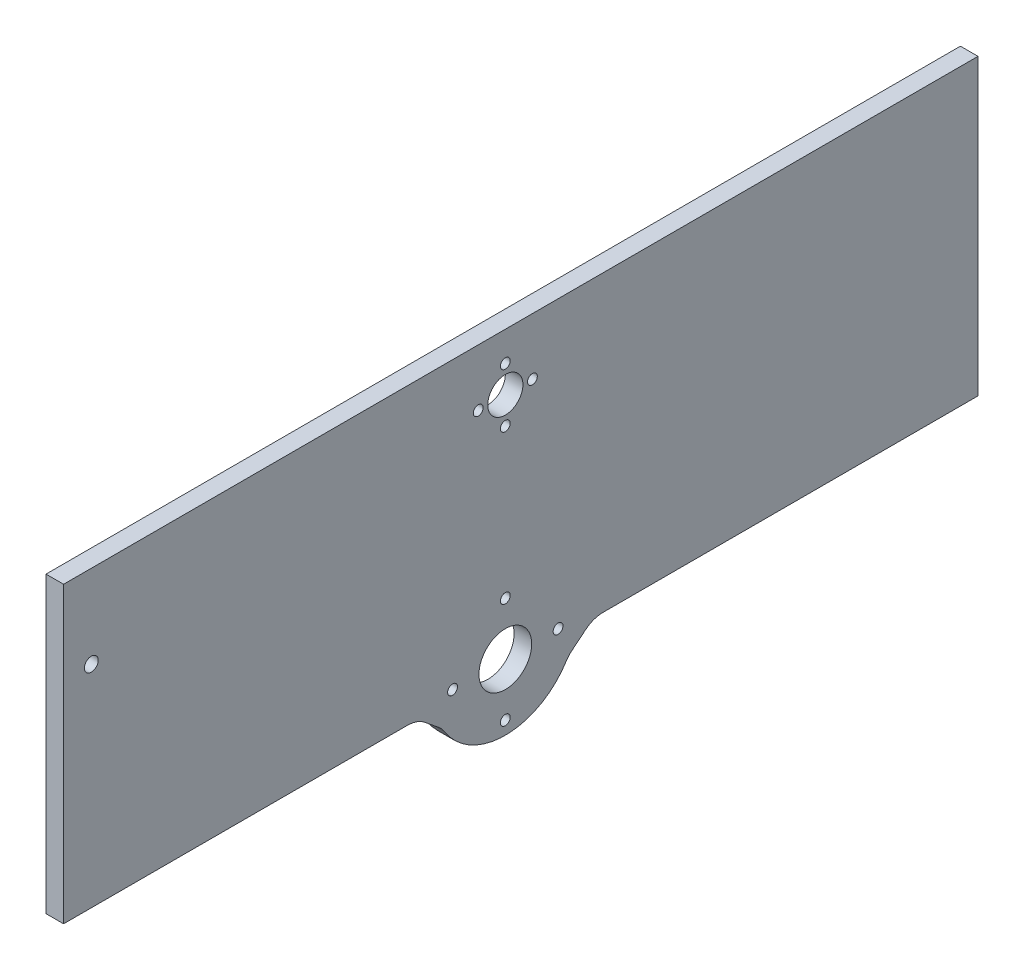
ISO-10303-21;
HEADER;
FILE_DESCRIPTION(('STEP AP214'),'2;1');
FILE_NAME('part.step','',(''),(''),'','','');
FILE_SCHEMA(('AUTOMOTIVE_DESIGN { 1 0 10303 214 1 1 1 1 }'));
ENDSEC;
DATA;
#1=APPLICATION_CONTEXT('core data for automotive mechanical design processes');
#2=APPLICATION_PROTOCOL_DEFINITION('international standard','automotive_design',2000,#1);
#3=PRODUCT_CONTEXT('',#1,'mechanical');
#4=PRODUCT('Part','Part','',(#3));
#5=PRODUCT_RELATED_PRODUCT_CATEGORY('part','',(#4));
#6=PRODUCT_DEFINITION_FORMATION('','',#4);
#7=PRODUCT_DEFINITION_CONTEXT('part definition',#1,'design');
#8=PRODUCT_DEFINITION('design','',#6,#7);
#9=PRODUCT_DEFINITION_SHAPE('','',#8);
#10=(LENGTH_UNIT() NAMED_UNIT(*) SI_UNIT(.MILLI.,.METRE.));
#11=(NAMED_UNIT(*) PLANE_ANGLE_UNIT() SI_UNIT($,.RADIAN.));
#12=(NAMED_UNIT(*) SI_UNIT($,.STERADIAN.) SOLID_ANGLE_UNIT());
#13=UNCERTAINTY_MEASURE_WITH_UNIT(LENGTH_MEASURE(1.E-05),#10,'distance_accuracy_value','');
#14=(GEOMETRIC_REPRESENTATION_CONTEXT(3) GLOBAL_UNCERTAINTY_ASSIGNED_CONTEXT((#13)) GLOBAL_UNIT_ASSIGNED_CONTEXT((#10,
#11,#12)) REPRESENTATION_CONTEXT('',''));
#15=CARTESIAN_POINT('',(0.,0.,0.));
#16=DIRECTION('',(0.,0.,1.));
#17=DIRECTION('',(1.,0.,0.));
#18=AXIS2_PLACEMENT_3D('',#15,#16,#17);
#19=CARTESIAN_POINT('',(6.35,0.,0.));
#20=DIRECTION('',(-1.,0.,0.));
#21=DIRECTION('',(0.,0.,1.));
#22=AXIS2_PLACEMENT_3D('',#19,#20,#21);
#23=PLANE('',#22);
#24=CARTESIAN_POINT('',(6.35,97.0026,-10.));
#25=DIRECTION('',(1.,0.,0.));
#26=DIRECTION('',(0.,0.,-1.));
#27=AXIS2_PLACEMENT_3D('',#24,#25,#26);
#28=CIRCLE('',#27,2.5);
#29=CARTESIAN_POINT('',(6.35,97.0026,-12.5));
#30=VERTEX_POINT('',#29);
#31=EDGE_CURVE('E415',#30,#30,#28,.T.);
#32=ORIENTED_EDGE('',*,*,#31,.F.);
#33=EDGE_LOOP('',(#32));
#34=FACE_BOUND('',#33,.T.);
#35=CARTESIAN_POINT('',(6.35,116.2812,-159.512));
#36=DIRECTION('',(1.,0.,0.));
#37=DIRECTION('',(0.,0.,-1.));
#38=AXIS2_PLACEMENT_3D('',#35,#36,#37);
#39=CIRCLE('',#38,1.778);
#40=CARTESIAN_POINT('',(6.35,116.2812,-161.29));
#41=VERTEX_POINT('',#40);
#42=EDGE_CURVE('E443',#41,#41,#39,.T.);
#43=ORIENTED_EDGE('',*,*,#42,.F.);
#44=EDGE_LOOP('',(#43));
#45=FACE_BOUND('',#44,.T.);
#46=CARTESIAN_POINT('',(6.35,106.5022,-149.733));
#47=DIRECTION('',(1.,0.,0.));
#48=DIRECTION('',(0.,0.,-1.));
#49=AXIS2_PLACEMENT_3D('',#46,#47,#48);
#50=CIRCLE('',#49,1.778);
#51=CARTESIAN_POINT('',(6.35,106.5022,-151.511));
#52=VERTEX_POINT('',#51);
#53=EDGE_CURVE('E426',#52,#52,#50,.T.);
#54=ORIENTED_EDGE('',*,*,#53,.F.);
#55=EDGE_LOOP('',(#54));
#56=FACE_BOUND('',#55,.T.);
#57=CARTESIAN_POINT('',(6.35,106.5022,-169.291));
#58=DIRECTION('',(1.,0.,0.));
#59=DIRECTION('',(0.,0.,-1.));
#60=AXIS2_PLACEMENT_3D('',#57,#58,#59);
#61=CIRCLE('',#60,1.778);
#62=CARTESIAN_POINT('',(6.35,106.5022,-171.069));
#63=VERTEX_POINT('',#62);
#64=EDGE_CURVE('E427',#63,#63,#61,.T.);
#65=ORIENTED_EDGE('',*,*,#64,.F.);
#66=EDGE_LOOP('',(#65));
#67=FACE_BOUND('',#66,.T.);
#68=CARTESIAN_POINT('',(6.35,96.7232,-159.512));
#69=DIRECTION('',(1.,0.,0.));
#70=DIRECTION('',(0.,0.,-1.));
#71=AXIS2_PLACEMENT_3D('',#68,#69,#70);
#72=CIRCLE('',#71,1.778);
#73=CARTESIAN_POINT('',(6.35,96.7232,-161.29));
#74=VERTEX_POINT('',#73);
#75=EDGE_CURVE('E419',#74,#74,#72,.T.);
#76=ORIENTED_EDGE('',*,*,#75,.F.);
#77=EDGE_LOOP('',(#76));
#78=FACE_BOUND('',#77,.T.);
#79=CARTESIAN_POINT('',(6.35,106.5022,-159.512));
#80=DIRECTION('',(1.,0.,0.));
#81=DIRECTION('',(0.,0.,-1.));
#82=AXIS2_PLACEMENT_3D('',#79,#80,#81);
#83=CIRCLE('',#82,6.34999999999999);
#84=CARTESIAN_POINT('',(6.35,106.5022,-165.862));
#85=VERTEX_POINT('',#84);
#86=EDGE_CURVE('E442',#85,#85,#83,.T.);
#87=ORIENTED_EDGE('',*,*,#86,.F.);
#88=EDGE_LOOP('',(#87));
#89=FACE_BOUND('',#88,.T.);
#90=CARTESIAN_POINT('',(6.35,23.8252,-140.462));
#91=DIRECTION('',(1.,0.,0.));
#92=DIRECTION('',(0.,0.,-1.));
#93=AXIS2_PLACEMENT_3D('',#90,#91,#92);
#94=CIRCLE('',#93,1.77800000000001);
#95=CARTESIAN_POINT('',(6.35,23.8252,-142.24));
#96=VERTEX_POINT('',#95);
#97=EDGE_CURVE('E458',#96,#96,#94,.T.);
#98=ORIENTED_EDGE('',*,*,#97,.F.);
#99=EDGE_LOOP('',(#98));
#100=FACE_BOUND('',#99,.T.);
#101=CARTESIAN_POINT('',(6.35,42.8752,-159.512));
#102=DIRECTION('',(1.,0.,0.));
#103=DIRECTION('',(0.,0.,-1.));
#104=AXIS2_PLACEMENT_3D('',#101,#102,#103);
#105=CIRCLE('',#104,1.77800000000001);
#106=CARTESIAN_POINT('',(6.35,42.8752,-161.29));
#107=VERTEX_POINT('',#106);
#108=EDGE_CURVE('E467',#107,#107,#105,.T.);
#109=ORIENTED_EDGE('',*,*,#108,.F.);
#110=EDGE_LOOP('',(#109));
#111=FACE_BOUND('',#110,.T.);
#112=CARTESIAN_POINT('',(6.35,23.8252,-159.512));
#113=DIRECTION('',(1.,0.,0.));
#114=DIRECTION('',(0.,0.,-1.));
#115=AXIS2_PLACEMENT_3D('',#112,#113,#114);
#116=CIRCLE('',#115,9.52500000000002);
#117=CARTESIAN_POINT('',(6.35,23.8252,-169.037));
#118=VERTEX_POINT('',#117);
#119=EDGE_CURVE('E482',#118,#118,#116,.T.);
#120=ORIENTED_EDGE('',*,*,#119,.F.);
#121=EDGE_LOOP('',(#120));
#122=FACE_BOUND('',#121,.T.);
#123=CARTESIAN_POINT('',(6.35,23.8252,-178.562));
#124=DIRECTION('',(1.,0.,0.));
#125=DIRECTION('',(0.,0.,-1.));
#126=AXIS2_PLACEMENT_3D('',#123,#124,#125);
#127=CIRCLE('',#126,1.77800000000001);
#128=CARTESIAN_POINT('',(6.35,23.8252,-180.34));
#129=VERTEX_POINT('',#128);
#130=EDGE_CURVE('E466',#129,#129,#127,.T.);
#131=ORIENTED_EDGE('',*,*,#130,.F.);
#132=EDGE_LOOP('',(#131));
#133=FACE_BOUND('',#132,.T.);
#134=CARTESIAN_POINT('',(6.35,4.77520000000007,-159.512));
#135=DIRECTION('',(1.,0.,0.));
#136=DIRECTION('',(0.,0.,-1.));
#137=AXIS2_PLACEMENT_3D('',#134,#135,#136);
#138=CIRCLE('',#137,1.77800000000001);
#139=CARTESIAN_POINT('',(6.35,4.77520000000007,-161.29));
#140=VERTEX_POINT('',#139);
#141=EDGE_CURVE('E483',#140,#140,#138,.T.);
#142=ORIENTED_EDGE('',*,*,#141,.F.);
#143=EDGE_LOOP('',(#142));
#144=FACE_BOUND('',#143,.T.);
#145=DIRECTION('',(0.,0.,-1.));
#146=VECTOR('',#145,1.);
#147=CARTESIAN_POINT('',(6.35,20.8026000000001,0.));
#148=LINE('',#147,#146);
#149=CARTESIAN_POINT('',(6.35,20.8026000000001,0.));
#150=VERTEX_POINT('',#149);
#151=CARTESIAN_POINT('',(6.35,20.8026,-124.189615658331));
#152=VERTEX_POINT('',#151);
#153=EDGE_CURVE('E300',#150,#152,#148,.T.);
#154=ORIENTED_EDGE('',*,*,#153,.T.);
#155=CARTESIAN_POINT('',(6.35,10.8026,-124.189615658331));
#156=DIRECTION('',(-1.,0.,0.));
#157=DIRECTION('',(0.,0.,1.));
#158=AXIS2_PLACEMENT_3D('',#155,#156,#157);
#159=CIRCLE('',#158,10.);
#160=CARTESIAN_POINT('',(6.35,18.5390682624872,-130.525786333394));
#161=VERTEX_POINT('',#160);
#162=EDGE_CURVE('E110',#152,#161,#159,.T.);
#163=ORIENTED_EDGE('',*,*,#162,.T.);
#164=DIRECTION('',(0.,-0.633617067506308,-0.773646826248713));
#165=VECTOR('',#164,1.);
#166=CARTESIAN_POINT('',(6.35,75.0793742249907,-61.4900382352941));
#167=LINE('',#166,#165);
#168=CARTESIAN_POINT('',(6.35,14.479941473782,-135.481982620501));
#169=VERTEX_POINT('',#168);
#170=EDGE_CURVE('E245',#161,#169,#167,.T.);
#171=ORIENTED_EDGE('',*,*,#170,.T.);
#172=CARTESIAN_POINT('',(6.35,6.74347321129488,-129.145811945438));
#173=DIRECTION('',(-1.,0.,0.));
#174=DIRECTION('',(0.,0.,1.));
#175=AXIS2_PLACEMENT_3D('',#172,#173,#174);
#176=CIRCLE('',#175,10.);
#177=CARTESIAN_POINT('',(6.35,12.0805921788523,-137.602475656745));
#178=VERTEX_POINT('',#177);
#179=EDGE_CURVE('E292',#169,#178,#176,.T.);
#180=ORIENTED_EDGE('',*,*,#179,.T.);
#181=CARTESIAN_POINT('',(6.35,25.908,-159.512));
#182=DIRECTION('',(1.,0.,0.));
#183=DIRECTION('',(0.,0.,-1.));
#184=AXIS2_PLACEMENT_3D('',#181,#182,#183);
#185=CIRCLE('',#184,25.908);
#186=CARTESIAN_POINT('',(6.35,12.0805921788522,-181.421524343254));
#187=VERTEX_POINT('',#186);
#188=EDGE_CURVE('E211',#178,#187,#185,.T.);
#189=ORIENTED_EDGE('',*,*,#188,.T.);
#190=CARTESIAN_POINT('',(6.35,6.7434732112947,-189.878188054562));
#191=DIRECTION('',(-1.,0.,0.));
#192=DIRECTION('',(0.,0.,1.));
#193=AXIS2_PLACEMENT_3D('',#190,#191,#192);
#194=CIRCLE('',#193,10.);
#195=CARTESIAN_POINT('',(6.35,14.4799414737819,-183.542017379498));
#196=VERTEX_POINT('',#195);
#197=EDGE_CURVE('E283',#187,#196,#194,.T.);
#198=ORIENTED_EDGE('',*,*,#197,.T.);
#199=DIRECTION('',(0.,0.633617067506306,-0.773646826248715));
#200=VECTOR('',#199,1.);
#201=CARTESIAN_POINT('',(6.35,-81.304861308323,-66.5887147058818));
#202=LINE('',#201,#200);
#203=CARTESIAN_POINT('',(6.35,18.5390682624872,-188.498213666606));
#204=VERTEX_POINT('',#203);
#205=EDGE_CURVE('E237',#196,#204,#202,.T.);
#206=ORIENTED_EDGE('',*,*,#205,.T.);
#207=CARTESIAN_POINT('',(6.35,10.8026,-194.83438434167));
#208=DIRECTION('',(-1.,0.,0.));
#209=DIRECTION('',(0.,0.,1.));
#210=AXIS2_PLACEMENT_3D('',#207,#208,#209);
#211=CIRCLE('',#210,10.);
#212=CARTESIAN_POINT('',(6.35,20.8026,-194.83438434167));
#213=VERTEX_POINT('',#212);
#214=EDGE_CURVE('E280',#204,#213,#211,.T.);
#215=ORIENTED_EDGE('',*,*,#214,.T.);
#216=DIRECTION('',(0.,0.,-1.));
#217=VECTOR('',#216,1.);
#218=CARTESIAN_POINT('',(6.35,20.8026,0.));
#219=LINE('',#218,#217);
#220=CARTESIAN_POINT('',(6.35,20.8026,-330.2));
#221=VERTEX_POINT('',#220);
#222=EDGE_CURVE('E202',#213,#221,#219,.T.);
#223=ORIENTED_EDGE('',*,*,#222,.T.);
#224=DIRECTION('',(0.,1.,0.));
#225=VECTOR('',#224,1.);
#226=CARTESIAN_POINT('',(6.35,0.,-330.2));
#227=LINE('',#226,#225);
#228=CARTESIAN_POINT('',(6.35,127.,-330.2));
#229=VERTEX_POINT('',#228);
#230=EDGE_CURVE('E209',#221,#229,#227,.T.);
#231=ORIENTED_EDGE('',*,*,#230,.T.);
#232=DIRECTION('',(0.,0.,1.));
#233=VECTOR('',#232,1.);
#234=CARTESIAN_POINT('',(6.35,127.,0.));
#235=LINE('',#234,#233);
#236=CARTESIAN_POINT('',(6.35,127.,0.));
#237=VERTEX_POINT('',#236);
#238=EDGE_CURVE('E234',#229,#237,#235,.T.);
#239=ORIENTED_EDGE('',*,*,#238,.T.);
#240=DIRECTION('',(0.,-1.,0.));
#241=VECTOR('',#240,1.);
#242=CARTESIAN_POINT('',(6.35,0.,0.));
#243=LINE('',#242,#241);
#244=EDGE_CURVE('E222',#237,#150,#243,.T.);
#245=ORIENTED_EDGE('',*,*,#244,.T.);
#246=EDGE_LOOP('',(#154,#163,#171,#180,#189,#198,#206,#215,#223,#231,#239,#245));
#247=FACE_BOUND('',#246,.T.);
#248=ADVANCED_FACE('F101',(#34,#45,#56,#67,#78,#89,#100,#111,#122,#133,#144,#247),#23,.F.);
#249=CARTESIAN_POINT('',(0.,0.,0.));
#250=DIRECTION('',(-1.,0.,0.));
#251=DIRECTION('',(0.,0.,1.));
#252=AXIS2_PLACEMENT_3D('',#249,#250,#251);
#253=PLANE('',#252);
#254=CARTESIAN_POINT('',(0.,97.0026,-10.));
#255=DIRECTION('',(1.,0.,0.));
#256=DIRECTION('',(0.,0.,-1.));
#257=AXIS2_PLACEMENT_3D('',#254,#255,#256);
#258=CIRCLE('',#257,2.5);
#259=CARTESIAN_POINT('',(0.,97.0026,-12.5));
#260=VERTEX_POINT('',#259);
#261=EDGE_CURVE('E413',#260,#260,#258,.T.);
#262=ORIENTED_EDGE('',*,*,#261,.T.);
#263=EDGE_LOOP('',(#262));
#264=FACE_BOUND('',#263,.T.);
#265=CARTESIAN_POINT('',(0.,116.2812,-159.512));
#266=DIRECTION('',(1.,0.,0.));
#267=DIRECTION('',(0.,0.,-1.));
#268=AXIS2_PLACEMENT_3D('',#265,#266,#267);
#269=CIRCLE('',#268,1.778);
#270=CARTESIAN_POINT('',(0.,116.2812,-161.29));
#271=VERTEX_POINT('',#270);
#272=EDGE_CURVE('E438',#271,#271,#269,.T.);
#273=ORIENTED_EDGE('',*,*,#272,.T.);
#274=EDGE_LOOP('',(#273));
#275=FACE_BOUND('',#274,.T.);
#276=CARTESIAN_POINT('',(0.,106.5022,-149.733));
#277=DIRECTION('',(1.,0.,0.));
#278=DIRECTION('',(0.,0.,-1.));
#279=AXIS2_PLACEMENT_3D('',#276,#277,#278);
#280=CIRCLE('',#279,1.778);
#281=CARTESIAN_POINT('',(0.,106.5022,-151.511));
#282=VERTEX_POINT('',#281);
#283=EDGE_CURVE('E447',#282,#282,#280,.T.);
#284=ORIENTED_EDGE('',*,*,#283,.T.);
#285=EDGE_LOOP('',(#284));
#286=FACE_BOUND('',#285,.T.);
#287=CARTESIAN_POINT('',(0.,106.5022,-169.291));
#288=DIRECTION('',(1.,0.,0.));
#289=DIRECTION('',(0.,0.,-1.));
#290=AXIS2_PLACEMENT_3D('',#287,#288,#289);
#291=CIRCLE('',#290,1.778);
#292=CARTESIAN_POINT('',(0.,106.5022,-171.069));
#293=VERTEX_POINT('',#292);
#294=EDGE_CURVE('E422',#293,#293,#291,.T.);
#295=ORIENTED_EDGE('',*,*,#294,.T.);
#296=EDGE_LOOP('',(#295));
#297=FACE_BOUND('',#296,.T.);
#298=CARTESIAN_POINT('',(0.,96.7232,-159.512));
#299=DIRECTION('',(1.,0.,0.));
#300=DIRECTION('',(0.,0.,-1.));
#301=AXIS2_PLACEMENT_3D('',#298,#299,#300);
#302=CIRCLE('',#301,1.778);
#303=CARTESIAN_POINT('',(0.,96.7232,-161.29));
#304=VERTEX_POINT('',#303);
#305=EDGE_CURVE('E431',#304,#304,#302,.T.);
#306=ORIENTED_EDGE('',*,*,#305,.T.);
#307=EDGE_LOOP('',(#306));
#308=FACE_BOUND('',#307,.T.);
#309=CARTESIAN_POINT('',(0.,106.5022,-159.512));
#310=DIRECTION('',(1.,0.,0.));
#311=DIRECTION('',(0.,0.,-1.));
#312=AXIS2_PLACEMENT_3D('',#309,#310,#311);
#313=CIRCLE('',#312,6.34999999999999);
#314=CARTESIAN_POINT('',(0.,106.5022,-165.862));
#315=VERTEX_POINT('',#314);
#316=EDGE_CURVE('E454',#315,#315,#313,.T.);
#317=ORIENTED_EDGE('',*,*,#316,.T.);
#318=EDGE_LOOP('',(#317));
#319=FACE_BOUND('',#318,.T.);
#320=CARTESIAN_POINT('',(0.,23.8252,-140.462));
#321=DIRECTION('',(1.,0.,0.));
#322=DIRECTION('',(0.,0.,-1.));
#323=AXIS2_PLACEMENT_3D('',#320,#321,#322);
#324=CIRCLE('',#323,1.77800000000001);
#325=CARTESIAN_POINT('',(0.,23.8252,-142.24));
#326=VERTEX_POINT('',#325);
#327=EDGE_CURVE('E471',#326,#326,#324,.T.);
#328=ORIENTED_EDGE('',*,*,#327,.T.);
#329=EDGE_LOOP('',(#328));
#330=FACE_BOUND('',#329,.T.);
#331=CARTESIAN_POINT('',(0.,42.8752,-159.512));
#332=DIRECTION('',(1.,0.,0.));
#333=DIRECTION('',(0.,0.,-1.));
#334=AXIS2_PLACEMENT_3D('',#331,#332,#333);
#335=CIRCLE('',#334,1.77800000000001);
#336=CARTESIAN_POINT('',(0.,42.8752,-161.29));
#337=VERTEX_POINT('',#336);
#338=EDGE_CURVE('E462',#337,#337,#335,.T.);
#339=ORIENTED_EDGE('',*,*,#338,.T.);
#340=EDGE_LOOP('',(#339));
#341=FACE_BOUND('',#340,.T.);
#342=CARTESIAN_POINT('',(0.,23.8252,-159.512));
#343=DIRECTION('',(1.,0.,0.));
#344=DIRECTION('',(0.,0.,-1.));
#345=AXIS2_PLACEMENT_3D('',#342,#343,#344);
#346=CIRCLE('',#345,9.52500000000002);
#347=CARTESIAN_POINT('',(0.,23.8252,-169.037));
#348=VERTEX_POINT('',#347);
#349=EDGE_CURVE('E494',#348,#348,#346,.T.);
#350=ORIENTED_EDGE('',*,*,#349,.T.);
#351=EDGE_LOOP('',(#350));
#352=FACE_BOUND('',#351,.T.);
#353=CARTESIAN_POINT('',(0.,4.77520000000007,-159.512));
#354=DIRECTION('',(1.,0.,0.));
#355=DIRECTION('',(0.,0.,-1.));
#356=AXIS2_PLACEMENT_3D('',#353,#354,#355);
#357=CIRCLE('',#356,1.77800000000001);
#358=CARTESIAN_POINT('',(0.,4.77520000000007,-161.29));
#359=VERTEX_POINT('',#358);
#360=EDGE_CURVE('E478',#359,#359,#357,.T.);
#361=ORIENTED_EDGE('',*,*,#360,.T.);
#362=EDGE_LOOP('',(#361));
#363=FACE_BOUND('',#362,.T.);
#364=CARTESIAN_POINT('',(0.,23.8252,-178.562));
#365=DIRECTION('',(1.,0.,0.));
#366=DIRECTION('',(0.,0.,-1.));
#367=AXIS2_PLACEMENT_3D('',#364,#365,#366);
#368=CIRCLE('',#367,1.77800000000001);
#369=CARTESIAN_POINT('',(0.,23.8252,-180.34));
#370=VERTEX_POINT('',#369);
#371=EDGE_CURVE('E487',#370,#370,#368,.T.);
#372=ORIENTED_EDGE('',*,*,#371,.T.);
#373=EDGE_LOOP('',(#372));
#374=FACE_BOUND('',#373,.T.);
#375=DIRECTION('',(0.,0.,-1.));
#376=VECTOR('',#375,1.);
#377=CARTESIAN_POINT('',(0.,20.8026,0.));
#378=LINE('',#377,#376);
#379=CARTESIAN_POINT('',(0.,20.8026,-194.83438434167));
#380=VERTEX_POINT('',#379);
#381=CARTESIAN_POINT('',(0.,20.8026,-330.2));
#382=VERTEX_POINT('',#381);
#383=EDGE_CURVE('E192',#380,#382,#378,.T.);
#384=ORIENTED_EDGE('',*,*,#383,.F.);
#385=CARTESIAN_POINT('',(0.,10.8026,-194.83438434167));
#386=DIRECTION('',(-1.,0.,0.));
#387=DIRECTION('',(0.,0.,1.));
#388=AXIS2_PLACEMENT_3D('',#385,#386,#387);
#389=CIRCLE('',#388,10.);
#390=CARTESIAN_POINT('',(0.,18.5390682624872,-188.498213666606));
#391=VERTEX_POINT('',#390);
#392=EDGE_CURVE('E277',#380,#391,#389,.F.);
#393=ORIENTED_EDGE('',*,*,#392,.T.);
#394=DIRECTION('',(0.,-0.633617067506306,0.773646826248715));
#395=VECTOR('',#394,1.);
#396=CARTESIAN_POINT('',(0.,13.3659537180331,-182.181837649639));
#397=LINE('',#396,#395);
#398=CARTESIAN_POINT('',(0.,14.4799414737819,-183.542017379498));
#399=VERTEX_POINT('',#398);
#400=EDGE_CURVE('E241',#391,#399,#397,.T.);
#401=ORIENTED_EDGE('',*,*,#400,.T.);
#402=CARTESIAN_POINT('',(0.,6.7434732112947,-189.878188054562));
#403=DIRECTION('',(-1.,0.,0.));
#404=DIRECTION('',(0.,0.,1.));
#405=AXIS2_PLACEMENT_3D('',#402,#403,#404);
#406=CIRCLE('',#405,10.);
#407=CARTESIAN_POINT('',(0.,12.0805921788522,-181.421524343254));
#408=VERTEX_POINT('',#407);
#409=EDGE_CURVE('E286',#399,#408,#406,.F.);
#410=ORIENTED_EDGE('',*,*,#409,.T.);
#411=CARTESIAN_POINT('',(0.,25.908,-159.512));
#412=DIRECTION('',(1.,0.,0.));
#413=DIRECTION('',(0.,0.,-1.));
#414=AXIS2_PLACEMENT_3D('',#411,#412,#413);
#415=CIRCLE('',#414,25.908);
#416=CARTESIAN_POINT('',(0.,12.0805921788523,-137.602475656745));
#417=VERTEX_POINT('',#416);
#418=EDGE_CURVE('E310',#417,#408,#415,.T.);
#419=ORIENTED_EDGE('',*,*,#418,.F.);
#420=CARTESIAN_POINT('',(0.,6.74347321129488,-129.145811945438));
#421=DIRECTION('',(-1.,0.,0.));
#422=DIRECTION('',(0.,0.,1.));
#423=AXIS2_PLACEMENT_3D('',#420,#421,#422);
#424=CIRCLE('',#423,10.);
#425=CARTESIAN_POINT('',(0.,14.479941473782,-135.481982620501));
#426=VERTEX_POINT('',#425);
#427=EDGE_CURVE('E289',#417,#426,#424,.F.);
#428=ORIENTED_EDGE('',*,*,#427,.T.);
#429=DIRECTION('',(0.,0.633617067506308,0.773646826248713));
#430=VECTOR('',#429,1.);
#431=CARTESIAN_POINT('',(0.,20.8026,-127.762012700003));
#432=LINE('',#431,#430);
#433=CARTESIAN_POINT('',(0.,18.5390682624872,-130.525786333394));
#434=VERTEX_POINT('',#433);
#435=EDGE_CURVE('E249',#426,#434,#432,.T.);
#436=ORIENTED_EDGE('',*,*,#435,.T.);
#437=CARTESIAN_POINT('',(0.,10.8026,-124.189615658331));
#438=DIRECTION('',(-1.,0.,0.));
#439=DIRECTION('',(0.,0.,1.));
#440=AXIS2_PLACEMENT_3D('',#437,#438,#439);
#441=CIRCLE('',#440,10.);
#442=CARTESIAN_POINT('',(0.,20.8026,-124.189615658331));
#443=VERTEX_POINT('',#442);
#444=EDGE_CURVE('E12',#434,#443,#441,.F.);
#445=ORIENTED_EDGE('',*,*,#444,.T.);
#446=DIRECTION('',(0.,0.,-1.));
#447=VECTOR('',#446,1.);
#448=CARTESIAN_POINT('',(0.,20.8026000000001,0.));
#449=LINE('',#448,#447);
#450=CARTESIAN_POINT('',(0.,20.8026000000001,0.));
#451=VERTEX_POINT('',#450);
#452=EDGE_CURVE('E308',#451,#443,#449,.T.);
#453=ORIENTED_EDGE('',*,*,#452,.F.);
#454=DIRECTION('',(0.,-1.,0.));
#455=VECTOR('',#454,1.);
#456=CARTESIAN_POINT('',(0.,0.,0.));
#457=LINE('',#456,#455);
#458=CARTESIAN_POINT('',(0.,127.,0.));
#459=VERTEX_POINT('',#458);
#460=EDGE_CURVE('E218',#459,#451,#457,.T.);
#461=ORIENTED_EDGE('',*,*,#460,.F.);
#462=DIRECTION('',(0.,0.,1.));
#463=VECTOR('',#462,1.);
#464=CARTESIAN_POINT('',(0.,127.,0.));
#465=LINE('',#464,#463);
#466=CARTESIAN_POINT('',(0.,127.,-330.2));
#467=VERTEX_POINT('',#466);
#468=EDGE_CURVE('E216',#467,#459,#465,.T.);
#469=ORIENTED_EDGE('',*,*,#468,.F.);
#470=DIRECTION('',(0.,1.,0.));
#471=VECTOR('',#470,1.);
#472=CARTESIAN_POINT('',(0.,0.,-330.2));
#473=LINE('',#472,#471);
#474=EDGE_CURVE('E207',#382,#467,#473,.T.);
#475=ORIENTED_EDGE('',*,*,#474,.F.);
#476=EDGE_LOOP('',(#384,#393,#401,#410,#419,#428,#436,#445,#453,#461,#469,#475));
#477=FACE_BOUND('',#476,.T.);
#478=ADVANCED_FACE('F214',(#264,#275,#286,#297,#308,#319,#330,#341,#352,#363,#374,#477),#253,.T.);
#479=CARTESIAN_POINT('',(6.35,0.,-330.2));
#480=DIRECTION('',(0.,0.,1.));
#481=DIRECTION('',(1.,0.,0.));
#482=AXIS2_PLACEMENT_3D('',#479,#480,#481);
#483=PLANE('',#482);
#484=DIRECTION('',(1.,0.,0.));
#485=VECTOR('',#484,1.);
#486=CARTESIAN_POINT('',(0.,20.8026,-330.2));
#487=LINE('',#486,#485);
#488=EDGE_CURVE('E196',#382,#221,#487,.T.);
#489=ORIENTED_EDGE('',*,*,#488,.F.);
#490=ORIENTED_EDGE('',*,*,#474,.T.);
#491=DIRECTION('',(-1.,0.,0.));
#492=VECTOR('',#491,1.);
#493=CARTESIAN_POINT('',(6.35,127.,-330.2));
#494=LINE('',#493,#492);
#495=EDGE_CURVE('E233',#229,#467,#494,.T.);
#496=ORIENTED_EDGE('',*,*,#495,.F.);
#497=ORIENTED_EDGE('',*,*,#230,.F.);
#498=EDGE_LOOP('',(#489,#490,#496,#497));
#499=FACE_BOUND('',#498,.T.);
#500=ADVANCED_FACE('F205',(#499),#483,.F.);
#501=CARTESIAN_POINT('',(6.35,0.,0.));
#502=DIRECTION('',(0.,0.,-1.));
#503=DIRECTION('',(-1.,0.,0.));
#504=AXIS2_PLACEMENT_3D('',#501,#502,#503);
#505=PLANE('',#504);
#506=DIRECTION('',(1.,0.,0.));
#507=VECTOR('',#506,1.);
#508=CARTESIAN_POINT('',(0.,20.8026000000001,0.));
#509=LINE('',#508,#507);
#510=EDGE_CURVE('E225',#451,#150,#509,.T.);
#511=ORIENTED_EDGE('',*,*,#510,.T.);
#512=ORIENTED_EDGE('',*,*,#244,.F.);
#513=DIRECTION('',(-1.,0.,0.));
#514=VECTOR('',#513,1.);
#515=CARTESIAN_POINT('',(6.35,127.,0.));
#516=LINE('',#515,#514);
#517=EDGE_CURVE('E229',#237,#459,#516,.T.);
#518=ORIENTED_EDGE('',*,*,#517,.T.);
#519=ORIENTED_EDGE('',*,*,#460,.T.);
#520=EDGE_LOOP('',(#511,#512,#518,#519));
#521=FACE_BOUND('',#520,.T.);
#522=ADVANCED_FACE('F333',(#521),#505,.F.);
#523=CARTESIAN_POINT('',(6.35,127.,0.));
#524=DIRECTION('',(0.,-1.,0.));
#525=DIRECTION('',(0.,0.,-1.));
#526=AXIS2_PLACEMENT_3D('',#523,#524,#525);
#527=PLANE('',#526);
#528=ORIENTED_EDGE('',*,*,#468,.T.);
#529=ORIENTED_EDGE('',*,*,#517,.F.);
#530=ORIENTED_EDGE('',*,*,#238,.F.);
#531=ORIENTED_EDGE('',*,*,#495,.T.);
#532=EDGE_LOOP('',(#528,#529,#530,#531));
#533=FACE_BOUND('',#532,.T.);
#534=ADVANCED_FACE('F331',(#533),#527,.F.);
#535=CARTESIAN_POINT('',(0.,25.908,-159.512));
#536=DIRECTION('',(1.,0.,0.));
#537=DIRECTION('',(0.,0.,-1.));
#538=AXIS2_PLACEMENT_3D('',#535,#536,#537);
#539=CYLINDRICAL_SURFACE('',#538,25.908);
#540=ORIENTED_EDGE('',*,*,#418,.T.);
#541=DIRECTION('',(1.,0.,0.));
#542=VECTOR('',#541,1.);
#543=CARTESIAN_POINT('',(0.,12.0805921788522,-181.421524343254));
#544=LINE('',#543,#542);
#545=EDGE_CURVE('E264',#408,#187,#544,.T.);
#546=ORIENTED_EDGE('',*,*,#545,.T.);
#547=ORIENTED_EDGE('',*,*,#188,.F.);
#548=DIRECTION('',(1.,0.,0.));
#549=VECTOR('',#548,1.);
#550=CARTESIAN_POINT('',(0.,12.0805921788523,-137.602475656745));
#551=LINE('',#550,#549);
#552=EDGE_CURVE('E260',#178,#417,#551,.F.);
#553=ORIENTED_EDGE('',*,*,#552,.T.);
#554=EDGE_LOOP('',(#540,#546,#547,#553));
#555=FACE_BOUND('',#554,.T.);
#556=ADVANCED_FACE('F340',(#555),#539,.T.);
#557=CARTESIAN_POINT('',(0.,20.8026000000001,0.));
#558=DIRECTION('',(0.,-1.,0.));
#559=DIRECTION('',(0.,0.,-1.));
#560=AXIS2_PLACEMENT_3D('',#557,#558,#559);
#561=PLANE('',#560);
#562=ORIENTED_EDGE('',*,*,#452,.T.);
#563=DIRECTION('',(1.,0.,0.));
#564=VECTOR('',#563,1.);
#565=CARTESIAN_POINT('',(0.,20.8026,-124.189615658331));
#566=LINE('',#565,#564);
#567=EDGE_CURVE('E274',#443,#152,#566,.T.);
#568=ORIENTED_EDGE('',*,*,#567,.T.);
#569=ORIENTED_EDGE('',*,*,#153,.F.);
#570=ORIENTED_EDGE('',*,*,#510,.F.);
#571=EDGE_LOOP('',(#562,#568,#569,#570));
#572=FACE_BOUND('',#571,.T.);
#573=ADVANCED_FACE('F306',(#572),#561,.T.);
#574=CARTESIAN_POINT('',(0.,20.8026,0.));
#575=DIRECTION('',(0.,-1.,0.));
#576=DIRECTION('',(0.,0.,-1.));
#577=AXIS2_PLACEMENT_3D('',#574,#575,#576);
#578=PLANE('',#577);
#579=ORIENTED_EDGE('',*,*,#222,.F.);
#580=DIRECTION('',(-1.,0.,0.));
#581=VECTOR('',#580,1.);
#582=CARTESIAN_POINT('',(0.,20.8026,-194.83438434167));
#583=LINE('',#582,#581);
#584=EDGE_CURVE('E199',#213,#380,#583,.T.);
#585=ORIENTED_EDGE('',*,*,#584,.T.);
#586=ORIENTED_EDGE('',*,*,#383,.T.);
#587=ORIENTED_EDGE('',*,*,#488,.T.);
#588=EDGE_LOOP('',(#579,#585,#586,#587));
#589=FACE_BOUND('',#588,.T.);
#590=ADVANCED_FACE('F195',(#589),#578,.T.);
#591=CARTESIAN_POINT('',(0.,23.8252,-178.562));
#592=DIRECTION('',(1.,0.,0.));
#593=DIRECTION('',(0.,0.,-1.));
#594=AXIS2_PLACEMENT_3D('',#591,#592,#593);
#595=CYLINDRICAL_SURFACE('',#594,1.77800000000001);
#596=ORIENTED_EDGE('',*,*,#371,.F.);
#597=EDGE_LOOP('',(#596));
#598=FACE_BOUND('',#597,.T.);
#599=ORIENTED_EDGE('',*,*,#130,.T.);
#600=EDGE_LOOP('',(#599));
#601=FACE_BOUND('',#600,.T.);
#602=ADVANCED_FACE('F362',(#598,#601),#595,.F.);
#603=CARTESIAN_POINT('',(0.,4.77520000000007,-159.512));
#604=DIRECTION('',(1.,0.,0.));
#605=DIRECTION('',(0.,0.,-1.));
#606=AXIS2_PLACEMENT_3D('',#603,#604,#605);
#607=CYLINDRICAL_SURFACE('',#606,1.77800000000001);
#608=ORIENTED_EDGE('',*,*,#360,.F.);
#609=EDGE_LOOP('',(#608));
#610=FACE_BOUND('',#609,.T.);
#611=ORIENTED_EDGE('',*,*,#141,.T.);
#612=EDGE_LOOP('',(#611));
#613=FACE_BOUND('',#612,.T.);
#614=ADVANCED_FACE('F367',(#610,#613),#607,.F.);
#615=CARTESIAN_POINT('',(0.,23.8252,-159.512));
#616=DIRECTION('',(1.,0.,0.));
#617=DIRECTION('',(0.,0.,-1.));
#618=AXIS2_PLACEMENT_3D('',#615,#616,#617);
#619=CYLINDRICAL_SURFACE('',#618,9.52500000000002);
#620=ORIENTED_EDGE('',*,*,#349,.F.);
#621=EDGE_LOOP('',(#620));
#622=FACE_BOUND('',#621,.T.);
#623=ORIENTED_EDGE('',*,*,#119,.T.);
#624=EDGE_LOOP('',(#623));
#625=FACE_BOUND('',#624,.T.);
#626=ADVANCED_FACE('F363',(#622,#625),#619,.F.);
#627=CARTESIAN_POINT('',(0.,42.8752,-159.512));
#628=DIRECTION('',(1.,0.,0.));
#629=DIRECTION('',(0.,0.,-1.));
#630=AXIS2_PLACEMENT_3D('',#627,#628,#629);
#631=CYLINDRICAL_SURFACE('',#630,1.77800000000001);
#632=ORIENTED_EDGE('',*,*,#338,.F.);
#633=EDGE_LOOP('',(#632));
#634=FACE_BOUND('',#633,.T.);
#635=ORIENTED_EDGE('',*,*,#108,.T.);
#636=EDGE_LOOP('',(#635));
#637=FACE_BOUND('',#636,.T.);
#638=ADVANCED_FACE('F366',(#634,#637),#631,.F.);
#639=CARTESIAN_POINT('',(0.,23.8252,-140.462));
#640=DIRECTION('',(1.,0.,0.));
#641=DIRECTION('',(0.,0.,-1.));
#642=AXIS2_PLACEMENT_3D('',#639,#640,#641);
#643=CYLINDRICAL_SURFACE('',#642,1.77800000000001);
#644=ORIENTED_EDGE('',*,*,#327,.F.);
#645=EDGE_LOOP('',(#644));
#646=FACE_BOUND('',#645,.T.);
#647=ORIENTED_EDGE('',*,*,#97,.T.);
#648=EDGE_LOOP('',(#647));
#649=FACE_BOUND('',#648,.T.);
#650=ADVANCED_FACE('F375',(#646,#649),#643,.F.);
#651=CARTESIAN_POINT('',(0.,106.5022,-159.512));
#652=DIRECTION('',(1.,0.,0.));
#653=DIRECTION('',(0.,0.,-1.));
#654=AXIS2_PLACEMENT_3D('',#651,#652,#653);
#655=CYLINDRICAL_SURFACE('',#654,6.34999999999999);
#656=ORIENTED_EDGE('',*,*,#316,.F.);
#657=EDGE_LOOP('',(#656));
#658=FACE_BOUND('',#657,.T.);
#659=ORIENTED_EDGE('',*,*,#86,.T.);
#660=EDGE_LOOP('',(#659));
#661=FACE_BOUND('',#660,.T.);
#662=ADVANCED_FACE('F378',(#658,#661),#655,.F.);
#663=CARTESIAN_POINT('',(0.,96.7232,-159.512));
#664=DIRECTION('',(1.,0.,0.));
#665=DIRECTION('',(0.,0.,-1.));
#666=AXIS2_PLACEMENT_3D('',#663,#664,#665);
#667=CYLINDRICAL_SURFACE('',#666,1.778);
#668=ORIENTED_EDGE('',*,*,#305,.F.);
#669=EDGE_LOOP('',(#668));
#670=FACE_BOUND('',#669,.T.);
#671=ORIENTED_EDGE('',*,*,#75,.T.);
#672=EDGE_LOOP('',(#671));
#673=FACE_BOUND('',#672,.T.);
#674=ADVANCED_FACE('F385',(#670,#673),#667,.F.);
#675=CARTESIAN_POINT('',(0.,106.5022,-169.291));
#676=DIRECTION('',(1.,0.,0.));
#677=DIRECTION('',(0.,0.,-1.));
#678=AXIS2_PLACEMENT_3D('',#675,#676,#677);
#679=CYLINDRICAL_SURFACE('',#678,1.778);
#680=ORIENTED_EDGE('',*,*,#294,.F.);
#681=EDGE_LOOP('',(#680));
#682=FACE_BOUND('',#681,.T.);
#683=ORIENTED_EDGE('',*,*,#64,.T.);
#684=EDGE_LOOP('',(#683));
#685=FACE_BOUND('',#684,.T.);
#686=ADVANCED_FACE('F391',(#682,#685),#679,.F.);
#687=CARTESIAN_POINT('',(0.,106.5022,-149.733));
#688=DIRECTION('',(1.,0.,0.));
#689=DIRECTION('',(0.,0.,-1.));
#690=AXIS2_PLACEMENT_3D('',#687,#688,#689);
#691=CYLINDRICAL_SURFACE('',#690,1.778);
#692=ORIENTED_EDGE('',*,*,#283,.F.);
#693=EDGE_LOOP('',(#692));
#694=FACE_BOUND('',#693,.T.);
#695=ORIENTED_EDGE('',*,*,#53,.T.);
#696=EDGE_LOOP('',(#695));
#697=FACE_BOUND('',#696,.T.);
#698=ADVANCED_FACE('F387',(#694,#697),#691,.F.);
#699=CARTESIAN_POINT('',(0.,116.2812,-159.512));
#700=DIRECTION('',(1.,0.,0.));
#701=DIRECTION('',(0.,0.,-1.));
#702=AXIS2_PLACEMENT_3D('',#699,#700,#701);
#703=CYLINDRICAL_SURFACE('',#702,1.778);
#704=ORIENTED_EDGE('',*,*,#272,.F.);
#705=EDGE_LOOP('',(#704));
#706=FACE_BOUND('',#705,.T.);
#707=ORIENTED_EDGE('',*,*,#42,.T.);
#708=EDGE_LOOP('',(#707));
#709=FACE_BOUND('',#708,.T.);
#710=ADVANCED_FACE('F390',(#706,#709),#703,.F.);
#711=CARTESIAN_POINT('',(0.,13.3659537180331,-182.181837649639));
#712=DIRECTION('',(0.,0.773646826248715,0.633617067506306));
#713=DIRECTION('',(1.,0.,0.));
#714=AXIS2_PLACEMENT_3D('',#711,#712,#713);
#715=PLANE('',#714);
#716=ORIENTED_EDGE('',*,*,#400,.F.);
#717=DIRECTION('',(-1.,0.,0.));
#718=VECTOR('',#717,1.);
#719=CARTESIAN_POINT('',(0.,18.5390682624872,-188.498213666606));
#720=LINE('',#719,#718);
#721=EDGE_CURVE('E257',#391,#204,#720,.F.);
#722=ORIENTED_EDGE('',*,*,#721,.T.);
#723=ORIENTED_EDGE('',*,*,#205,.F.);
#724=DIRECTION('',(1.,0.,0.));
#725=VECTOR('',#724,1.);
#726=CARTESIAN_POINT('',(0.,14.4799414737819,-183.542017379498));
#727=LINE('',#726,#725);
#728=EDGE_CURVE('E254',#196,#399,#727,.F.);
#729=ORIENTED_EDGE('',*,*,#728,.T.);
#730=EDGE_LOOP('',(#716,#722,#723,#729));
#731=FACE_BOUND('',#730,.T.);
#732=ADVANCED_FACE('F395',(#731),#715,.F.);
#733=CARTESIAN_POINT('',(0.,20.8026,-127.762012700003));
#734=DIRECTION('',(0.,0.773646826248713,-0.633617067506308));
#735=DIRECTION('',(1.,0.,0.));
#736=AXIS2_PLACEMENT_3D('',#733,#734,#735);
#737=PLANE('',#736);
#738=ORIENTED_EDGE('',*,*,#435,.F.);
#739=DIRECTION('',(1.,0.,0.));
#740=VECTOR('',#739,1.);
#741=CARTESIAN_POINT('',(0.,14.479941473782,-135.481982620501));
#742=LINE('',#741,#740);
#743=EDGE_CURVE('E271',#426,#169,#742,.T.);
#744=ORIENTED_EDGE('',*,*,#743,.T.);
#745=ORIENTED_EDGE('',*,*,#170,.F.);
#746=DIRECTION('',(1.,0.,0.));
#747=VECTOR('',#746,1.);
#748=CARTESIAN_POINT('',(0.,18.5390682624872,-130.525786333394));
#749=LINE('',#748,#747);
#750=EDGE_CURVE('E268',#161,#434,#749,.F.);
#751=ORIENTED_EDGE('',*,*,#750,.T.);
#752=EDGE_LOOP('',(#738,#744,#745,#751));
#753=FACE_BOUND('',#752,.T.);
#754=ADVANCED_FACE('F303',(#753),#737,.F.);
#755=CARTESIAN_POINT('',(0.,10.8026,-194.83438434167));
#756=DIRECTION('',(-1.,0.,0.));
#757=DIRECTION('',(0.,0.,1.));
#758=AXIS2_PLACEMENT_3D('',#755,#756,#757);
#759=CYLINDRICAL_SURFACE('',#758,10.);
#760=ORIENTED_EDGE('',*,*,#214,.F.);
#761=ORIENTED_EDGE('',*,*,#721,.F.);
#762=ORIENTED_EDGE('',*,*,#392,.F.);
#763=ORIENTED_EDGE('',*,*,#584,.F.);
#764=EDGE_LOOP('',(#760,#761,#762,#763));
#765=FACE_BOUND('',#764,.T.);
#766=ADVANCED_FACE('F504',(#765),#759,.F.);
#767=CARTESIAN_POINT('',(0.,6.7434732112947,-189.878188054562));
#768=DIRECTION('',(1.,0.,0.));
#769=DIRECTION('',(0.,0.,-1.));
#770=AXIS2_PLACEMENT_3D('',#767,#768,#769);
#771=CYLINDRICAL_SURFACE('',#770,10.);
#772=ORIENTED_EDGE('',*,*,#409,.F.);
#773=ORIENTED_EDGE('',*,*,#728,.F.);
#774=ORIENTED_EDGE('',*,*,#197,.F.);
#775=ORIENTED_EDGE('',*,*,#545,.F.);
#776=EDGE_LOOP('',(#772,#773,#774,#775));
#777=FACE_BOUND('',#776,.T.);
#778=ADVANCED_FACE('F512',(#777),#771,.F.);
#779=CARTESIAN_POINT('',(0.,6.74347321129488,-129.145811945438));
#780=DIRECTION('',(1.,0.,0.));
#781=DIRECTION('',(0.,0.,-1.));
#782=AXIS2_PLACEMENT_3D('',#779,#780,#781);
#783=CYLINDRICAL_SURFACE('',#782,10.);
#784=ORIENTED_EDGE('',*,*,#179,.F.);
#785=ORIENTED_EDGE('',*,*,#743,.F.);
#786=ORIENTED_EDGE('',*,*,#427,.F.);
#787=ORIENTED_EDGE('',*,*,#552,.F.);
#788=EDGE_LOOP('',(#784,#785,#786,#787));
#789=FACE_BOUND('',#788,.T.);
#790=ADVANCED_FACE('F409',(#789),#783,.F.);
#791=CARTESIAN_POINT('',(0.,10.8026,-124.189615658331));
#792=DIRECTION('',(1.,0.,0.));
#793=DIRECTION('',(0.,0.,-1.));
#794=AXIS2_PLACEMENT_3D('',#791,#792,#793);
#795=CYLINDRICAL_SURFACE('',#794,10.);
#796=ORIENTED_EDGE('',*,*,#444,.F.);
#797=ORIENTED_EDGE('',*,*,#750,.F.);
#798=ORIENTED_EDGE('',*,*,#162,.F.);
#799=ORIENTED_EDGE('',*,*,#567,.F.);
#800=EDGE_LOOP('',(#796,#797,#798,#799));
#801=FACE_BOUND('',#800,.T.);
#802=ADVANCED_FACE('F103',(#801),#795,.F.);
#803=CARTESIAN_POINT('',(0.,97.0026,-10.));
#804=DIRECTION('',(1.,0.,0.));
#805=DIRECTION('',(0.,0.,-1.));
#806=AXIS2_PLACEMENT_3D('',#803,#804,#805);
#807=CYLINDRICAL_SURFACE('',#806,2.5);
#808=ORIENTED_EDGE('',*,*,#261,.F.);
#809=EDGE_LOOP('',(#808));
#810=FACE_BOUND('',#809,.T.);
#811=ORIENTED_EDGE('',*,*,#31,.T.);
#812=EDGE_LOOP('',(#811));
#813=FACE_BOUND('',#812,.T.);
#814=ADVANCED_FACE('F403',(#810,#813),#807,.F.);
#815=CLOSED_SHELL('',(#248,#478,#500,#522,#534,#556,#573,#590,#602,#614,#626,#638,#650,#662,
#674,#686,#698,#710,#732,#754,#766,#778,#790,#802,#814));
#816=MANIFOLD_SOLID_BREP('B2',#815);
#817=ADVANCED_BREP_SHAPE_REPRESENTATION('',(#18,#816),#14);
#818=SHAPE_DEFINITION_REPRESENTATION(#9,#817);
ENDSEC;
END-ISO-10303-21;
